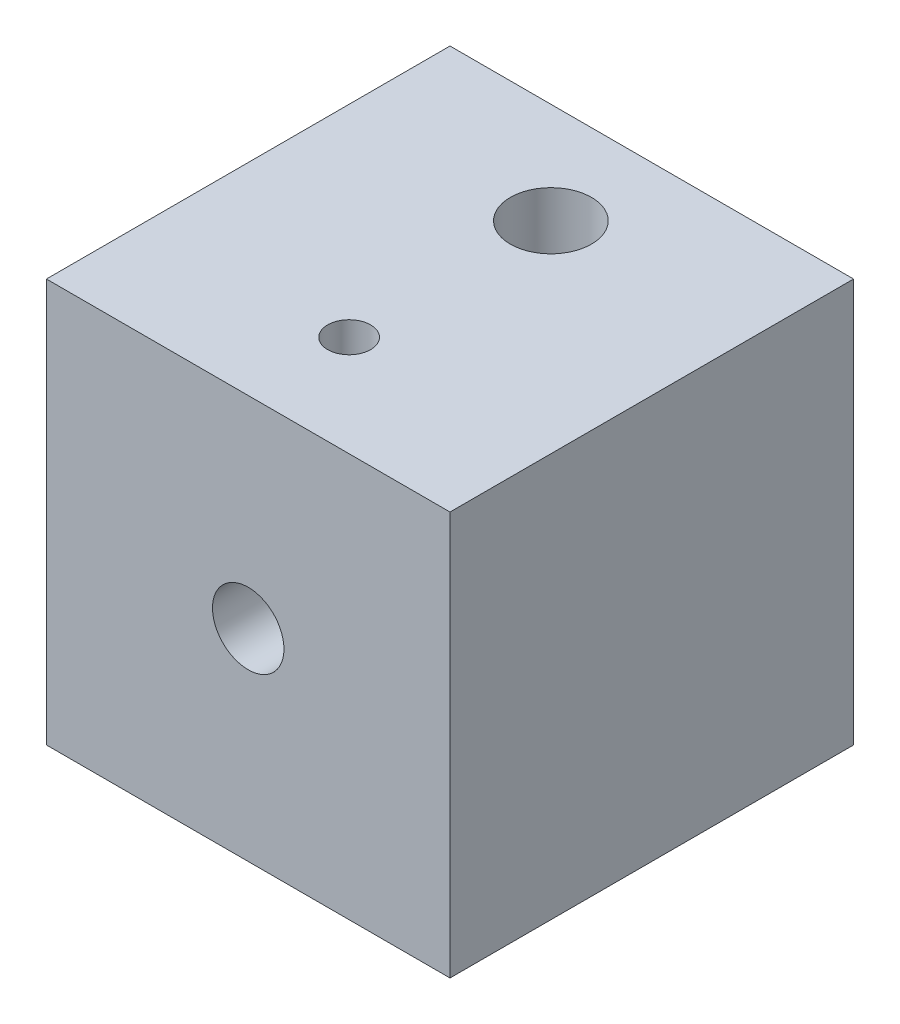
ISO-10303-21;
HEADER;
FILE_DESCRIPTION(('STEP AP214'),'2;1');
FILE_NAME('part.step','',(''),(''),'','','');
FILE_SCHEMA(('AUTOMOTIVE_DESIGN { 1 0 10303 214 1 1 1 1 }'));
ENDSEC;
DATA;
#1=APPLICATION_CONTEXT('core data for automotive mechanical design processes');
#2=APPLICATION_PROTOCOL_DEFINITION('international standard','automotive_design',2000,#1);
#3=PRODUCT_CONTEXT('',#1,'mechanical');
#4=PRODUCT('Part','Part','',(#3));
#5=PRODUCT_RELATED_PRODUCT_CATEGORY('part','',(#4));
#6=PRODUCT_DEFINITION_FORMATION('','',#4);
#7=PRODUCT_DEFINITION_CONTEXT('part definition',#1,'design');
#8=PRODUCT_DEFINITION('design','',#6,#7);
#9=PRODUCT_DEFINITION_SHAPE('','',#8);
#10=(LENGTH_UNIT() NAMED_UNIT(*) SI_UNIT(.MILLI.,.METRE.));
#11=(NAMED_UNIT(*) PLANE_ANGLE_UNIT() SI_UNIT($,.RADIAN.));
#12=(NAMED_UNIT(*) SI_UNIT($,.STERADIAN.) SOLID_ANGLE_UNIT());
#13=UNCERTAINTY_MEASURE_WITH_UNIT(LENGTH_MEASURE(1.E-05),#10,'distance_accuracy_value','');
#14=(GEOMETRIC_REPRESENTATION_CONTEXT(3) GLOBAL_UNCERTAINTY_ASSIGNED_CONTEXT((#13)) GLOBAL_UNIT_ASSIGNED_CONTEXT((#10,
#11,#12)) REPRESENTATION_CONTEXT('',''));
#15=CARTESIAN_POINT('',(0.,0.,0.));
#16=DIRECTION('',(0.,0.,1.));
#17=DIRECTION('',(1.,0.,0.));
#18=AXIS2_PLACEMENT_3D('',#15,#16,#17);
#19=CARTESIAN_POINT('',(-12.7,25.4,12.7));
#20=DIRECTION('',(1.,0.,0.));
#21=DIRECTION('',(0.,0.,-1.));
#22=AXIS2_PLACEMENT_3D('',#19,#20,#21);
#23=PLANE('',#22);
#24=DIRECTION('',(0.,0.,1.));
#25=VECTOR('',#24,1.);
#26=CARTESIAN_POINT('',(-12.7,0.,12.7));
#27=LINE('',#26,#25);
#28=CARTESIAN_POINT('',(-12.7,0.,-12.7));
#29=VERTEX_POINT('',#28);
#30=CARTESIAN_POINT('',(-12.7,0.,12.7));
#31=VERTEX_POINT('',#30);
#32=EDGE_CURVE('E100',#29,#31,#27,.T.);
#33=ORIENTED_EDGE('',*,*,#32,.T.);
#34=DIRECTION('',(0.,-1.,0.));
#35=VECTOR('',#34,1.);
#36=CARTESIAN_POINT('',(-12.7,25.4,12.7));
#37=LINE('',#36,#35);
#38=CARTESIAN_POINT('',(-12.7,25.4,12.7));
#39=VERTEX_POINT('',#38);
#40=EDGE_CURVE('E11',#39,#31,#37,.T.);
#41=ORIENTED_EDGE('',*,*,#40,.F.);
#42=DIRECTION('',(0.,0.,1.));
#43=VECTOR('',#42,1.);
#44=CARTESIAN_POINT('',(-12.7,25.4,12.7));
#45=LINE('',#44,#43);
#46=CARTESIAN_POINT('',(-12.7,25.4,-12.7));
#47=VERTEX_POINT('',#46);
#48=EDGE_CURVE('E88',#47,#39,#45,.T.);
#49=ORIENTED_EDGE('',*,*,#48,.F.);
#50=DIRECTION('',(0.,-1.,0.));
#51=VECTOR('',#50,1.);
#52=CARTESIAN_POINT('',(-12.7,25.4,-12.7));
#53=LINE('',#52,#51);
#54=EDGE_CURVE('E96',#47,#29,#53,.T.);
#55=ORIENTED_EDGE('',*,*,#54,.T.);
#56=EDGE_LOOP('',(#33,#41,#49,#55));
#57=FACE_BOUND('',#56,.T.);
#58=ADVANCED_FACE('F37',(#57),#23,.F.);
#59=CARTESIAN_POINT('',(12.7,25.4,12.7));
#60=DIRECTION('',(0.,0.,-1.));
#61=DIRECTION('',(-1.,0.,0.));
#62=AXIS2_PLACEMENT_3D('',#59,#60,#61);
#63=PLANE('',#62);
#64=CARTESIAN_POINT('',(0.,12.7,12.7));
#65=DIRECTION('',(0.,0.,1.));
#66=DIRECTION('',(1.,0.,0.));
#67=AXIS2_PLACEMENT_3D('',#64,#65,#66);
#68=CIRCLE('',#67,2.25);
#69=CARTESIAN_POINT('',(2.25,12.7,12.7));
#70=VERTEX_POINT('',#69);
#71=EDGE_CURVE('E103',#70,#70,#68,.T.);
#72=ORIENTED_EDGE('',*,*,#71,.F.);
#73=EDGE_LOOP('',(#72));
#74=FACE_BOUND('',#73,.T.);
#75=DIRECTION('',(1.,0.,0.));
#76=VECTOR('',#75,1.);
#77=CARTESIAN_POINT('',(12.7,0.,12.7));
#78=LINE('',#77,#76);
#79=CARTESIAN_POINT('',(12.7,0.,12.7));
#80=VERTEX_POINT('',#79);
#81=EDGE_CURVE('E92',#31,#80,#78,.T.);
#82=ORIENTED_EDGE('',*,*,#81,.T.);
#83=DIRECTION('',(0.,-1.,0.));
#84=VECTOR('',#83,1.);
#85=CARTESIAN_POINT('',(12.7,25.4,12.7));
#86=LINE('',#85,#84);
#87=CARTESIAN_POINT('',(12.7,25.4,12.7));
#88=VERTEX_POINT('',#87);
#89=EDGE_CURVE('E45',#88,#80,#86,.T.);
#90=ORIENTED_EDGE('',*,*,#89,.F.);
#91=DIRECTION('',(1.,0.,0.));
#92=VECTOR('',#91,1.);
#93=CARTESIAN_POINT('',(12.7,25.4,12.7));
#94=LINE('',#93,#92);
#95=EDGE_CURVE('E83',#39,#88,#94,.T.);
#96=ORIENTED_EDGE('',*,*,#95,.F.);
#97=ORIENTED_EDGE('',*,*,#40,.T.);
#98=EDGE_LOOP('',(#82,#90,#96,#97));
#99=FACE_BOUND('',#98,.T.);
#100=ADVANCED_FACE('F91',(#74,#99),#63,.F.);
#101=CARTESIAN_POINT('',(12.7,25.4,12.7));
#102=DIRECTION('',(-1.,0.,0.));
#103=DIRECTION('',(0.,0.,1.));
#104=AXIS2_PLACEMENT_3D('',#101,#102,#103);
#105=PLANE('',#104);
#106=DIRECTION('',(0.,0.,-1.));
#107=VECTOR('',#106,1.);
#108=CARTESIAN_POINT('',(12.7,0.,12.7));
#109=LINE('',#108,#107);
#110=CARTESIAN_POINT('',(12.7,0.,-12.7));
#111=VERTEX_POINT('',#110);
#112=EDGE_CURVE('E70',#80,#111,#109,.T.);
#113=ORIENTED_EDGE('',*,*,#112,.T.);
#114=DIRECTION('',(0.,-1.,0.));
#115=VECTOR('',#114,1.);
#116=CARTESIAN_POINT('',(12.7,25.4,-12.7));
#117=LINE('',#116,#115);
#118=CARTESIAN_POINT('',(12.7,25.4,-12.7));
#119=VERTEX_POINT('',#118);
#120=EDGE_CURVE('E93',#119,#111,#117,.T.);
#121=ORIENTED_EDGE('',*,*,#120,.F.);
#122=DIRECTION('',(0.,0.,-1.));
#123=VECTOR('',#122,1.);
#124=CARTESIAN_POINT('',(12.7,25.4,12.7));
#125=LINE('',#124,#123);
#126=EDGE_CURVE('E86',#88,#119,#125,.T.);
#127=ORIENTED_EDGE('',*,*,#126,.F.);
#128=ORIENTED_EDGE('',*,*,#89,.T.);
#129=EDGE_LOOP('',(#113,#121,#127,#128));
#130=FACE_BOUND('',#129,.T.);
#131=ADVANCED_FACE('F94',(#130),#105,.F.);
#132=CARTESIAN_POINT('',(12.7,25.4,-12.7));
#133=DIRECTION('',(0.,0.,1.));
#134=DIRECTION('',(1.,0.,0.));
#135=AXIS2_PLACEMENT_3D('',#132,#133,#134);
#136=PLANE('',#135);
#137=CARTESIAN_POINT('',(0.,12.7,-12.7));
#138=DIRECTION('',(0.,0.,-1.));
#139=DIRECTION('',(-1.,0.,0.));
#140=AXIS2_PLACEMENT_3D('',#137,#138,#139);
#141=CIRCLE('',#140,6.985);
#142=CARTESIAN_POINT('',(-6.985,12.7,-12.7));
#143=VERTEX_POINT('',#142);
#144=EDGE_CURVE('E120',#143,#143,#141,.T.);
#145=ORIENTED_EDGE('',*,*,#144,.F.);
#146=EDGE_LOOP('',(#145));
#147=FACE_BOUND('',#146,.T.);
#148=DIRECTION('',(-1.,0.,0.));
#149=VECTOR('',#148,1.);
#150=CARTESIAN_POINT('',(12.7,0.,-12.7));
#151=LINE('',#150,#149);
#152=EDGE_CURVE('E76',#111,#29,#151,.T.);
#153=ORIENTED_EDGE('',*,*,#152,.T.);
#154=ORIENTED_EDGE('',*,*,#54,.F.);
#155=DIRECTION('',(-1.,0.,0.));
#156=VECTOR('',#155,1.);
#157=CARTESIAN_POINT('',(12.7,25.4,-12.7));
#158=LINE('',#157,#156);
#159=EDGE_CURVE('E53',#119,#47,#158,.T.);
#160=ORIENTED_EDGE('',*,*,#159,.F.);
#161=ORIENTED_EDGE('',*,*,#120,.T.);
#162=EDGE_LOOP('',(#153,#154,#160,#161));
#163=FACE_BOUND('',#162,.T.);
#164=ADVANCED_FACE('F108',(#147,#163),#136,.F.);
#165=CARTESIAN_POINT('',(0.,25.4,0.));
#166=DIRECTION('',(0.,1.,0.));
#167=DIRECTION('',(0.,0.,1.));
#168=AXIS2_PLACEMENT_3D('',#165,#166,#167);
#169=PLANE('',#168);
#170=CARTESIAN_POINT('',(0.,25.4,-6.35));
#171=DIRECTION('',(0.,1.,0.));
#172=DIRECTION('',(0.,0.,1.));
#173=AXIS2_PLACEMENT_3D('',#170,#171,#172);
#174=CIRCLE('',#173,2.5527);
#175=CARTESIAN_POINT('',(0.,25.4,-3.7973));
#176=VERTEX_POINT('',#175);
#177=EDGE_CURVE('E153',#176,#176,#174,.T.);
#178=ORIENTED_EDGE('',*,*,#177,.F.);
#179=EDGE_LOOP('',(#178));
#180=FACE_BOUND('',#179,.T.);
#181=CARTESIAN_POINT('',(0.,25.4,6.35));
#182=DIRECTION('',(0.,1.,0.));
#183=DIRECTION('',(0.,0.,1.));
#184=AXIS2_PLACEMENT_3D('',#181,#182,#183);
#185=CIRCLE('',#184,1.35254999999999);
#186=CARTESIAN_POINT('',(0.,25.4,7.70254999999999));
#187=VERTEX_POINT('',#186);
#188=EDGE_CURVE('E133',#187,#187,#185,.T.);
#189=ORIENTED_EDGE('',*,*,#188,.F.);
#190=EDGE_LOOP('',(#189));
#191=FACE_BOUND('',#190,.T.);
#192=ORIENTED_EDGE('',*,*,#48,.T.);
#193=ORIENTED_EDGE('',*,*,#95,.T.);
#194=ORIENTED_EDGE('',*,*,#126,.T.);
#195=ORIENTED_EDGE('',*,*,#159,.T.);
#196=EDGE_LOOP('',(#192,#193,#194,#195));
#197=FACE_BOUND('',#196,.T.);
#198=ADVANCED_FACE('F84',(#180,#191,#197),#169,.T.);
#199=CARTESIAN_POINT('',(0.,0.,0.));
#200=DIRECTION('',(0.,1.,0.));
#201=DIRECTION('',(0.,0.,1.));
#202=AXIS2_PLACEMENT_3D('',#199,#200,#201);
#203=PLANE('',#202);
#204=ORIENTED_EDGE('',*,*,#32,.F.);
#205=ORIENTED_EDGE('',*,*,#152,.F.);
#206=ORIENTED_EDGE('',*,*,#112,.F.);
#207=ORIENTED_EDGE('',*,*,#81,.F.);
#208=EDGE_LOOP('',(#204,#205,#206,#207));
#209=FACE_BOUND('',#208,.T.);
#210=ADVANCED_FACE('F111',(#209),#203,.F.);
#211=CARTESIAN_POINT('',(0.,12.7,0.));
#212=DIRECTION('',(0.,0.,1.));
#213=DIRECTION('',(1.,0.,0.));
#214=AXIS2_PLACEMENT_3D('',#211,#212,#213);
#215=CYLINDRICAL_SURFACE('',#214,2.25);
#216=CARTESIAN_POINT('',(0.,14.95,7.70254999999999));
#217=CARTESIAN_POINT('',(0.0691663465562286,14.9499965582015,7.70254624051206));
#218=CARTESIAN_POINT('',(0.138441993777319,14.9467759995988,7.69720740303272));
#219=CARTESIAN_POINT('',(0.274907659000748,14.9341995828276,7.67612537949973));
#220=CARTESIAN_POINT('',(0.34209216343151,14.9248287429108,7.66035678640166));
#221=CARTESIAN_POINT('',(0.472109070479141,14.9009001743146,7.61930258533119));
#222=CARTESIAN_POINT('',(0.534961248817198,14.8863681771959,7.59406415571863));
#223=CARTESIAN_POINT('',(0.65534004842601,14.8533533368001,7.53508154373845));
#224=CARTESIAN_POINT('',(0.712867953286609,14.834871449347,7.50133941880544));
#225=CARTESIAN_POINT('',(0.825955531404719,14.7938448864383,7.42343341840502));
#226=CARTESIAN_POINT('',(0.881026569171476,14.7710974084211,7.3786690646969));
#227=CARTESIAN_POINT('',(0.983356150960087,14.7245194063919,7.28134193013879));
#228=CARTESIAN_POINT('',(1.03060449234187,14.7006875188712,7.22876913205521));
#229=CARTESIAN_POINT('',(1.12185227773009,14.6511430696786,7.10969732216007));
#230=CARTESIAN_POINT('',(1.16473451064853,14.6255604815232,7.04228057641531));
#231=CARTESIAN_POINT('',(1.23840199779142,14.5790334387161,6.89969406382967));
#232=CARTESIAN_POINT('',(1.26920692739231,14.5580814647428,6.82453716103412));
#233=CARTESIAN_POINT('',(1.31131315422063,14.528511069332,6.68717330640225));
#234=CARTESIAN_POINT('',(1.32553159551199,14.5181343277019,6.62624073075496));
#235=CARTESIAN_POINT('',(1.34540710548992,14.5034794617843,6.50230622263213));
#236=CARTESIAN_POINT('',(1.35107488112002,14.4991937108912,6.43930697921192));
#237=CARTESIAN_POINT('',(1.35352111427406,14.4973547046947,6.31290918535839));
#238=CARTESIAN_POINT('',(1.35028188948818,14.4998148414008,6.24951009028621));
#239=CARTESIAN_POINT('',(1.33508362508444,14.5111146851313,6.12433339564388));
#240=CARTESIAN_POINT('',(1.32311800542564,14.5199592061781,6.06255705613199));
#241=CARTESIAN_POINT('',(1.29132248024854,14.542649315132,5.94298811732664));
#242=CARTESIAN_POINT('',(1.2715995097706,14.5564266813539,5.88515339804227));
#243=CARTESIAN_POINT('',(1.22501560830925,14.5874901121005,5.77346340368081));
#244=CARTESIAN_POINT('',(1.19815206522393,14.6047774600683,5.71960959409813));
#245=CARTESIAN_POINT('',(1.13262049663752,14.6445778497762,5.60737357417374));
#246=CARTESIAN_POINT('',(1.09270844272989,14.6674756360272,5.54985380321864));
#247=CARTESIAN_POINT('',(1.00464204441058,14.7138709888924,5.44172969187937));
#248=CARTESIAN_POINT('',(0.956479789698275,14.7373691125402,5.3911320729916));
#249=CARTESIAN_POINT('',(0.845239746176339,14.786205654396,5.29108002821639));
#250=CARTESIAN_POINT('',(0.781017120452645,14.8113389839092,5.24278435724409));
#251=CARTESIAN_POINT('',(0.643848974151532,14.8571217017953,5.15779775231295));
#252=CARTESIAN_POINT('',(0.570908101435357,14.8777734629875,5.12110067262165));
#253=CARTESIAN_POINT('',(0.422942930715708,14.9111084787451,5.06297937950749));
#254=CARTESIAN_POINT('',(0.348336461238115,14.924210384158,5.04074140057072));
#255=CARTESIAN_POINT('',(0.195525060556504,14.942803686195,5.00939431995385));
#256=CARTESIAN_POINT('',(0.117324596807471,14.9483042805444,5.00026935075758));
#257=CARTESIAN_POINT('',(-0.0288647439610792,14.9508383501165,4.99605683434077));
#258=CARTESIAN_POINT('',(-0.0967920631799346,14.9489240898226,4.99922487001459));
#259=CARTESIAN_POINT('',(-0.230975024660799,14.9391232290591,5.01560572260461));
#260=CARTESIAN_POINT('',(-0.297230703822403,14.9312367605387,5.02881831759757));
#261=CARTESIAN_POINT('',(-0.42463255446565,14.9104876464588,5.06417536374375));
#262=CARTESIAN_POINT('',(-0.485864932166425,14.8977539716197,5.08608890854587));
#263=CARTESIAN_POINT('',(-0.603768813431152,14.8683310369898,5.13797403410806));
#264=CARTESIAN_POINT('',(-0.660439421608037,14.8516410031661,5.16794719182728));
#265=CARTESIAN_POINT('',(-0.77396616067724,14.8136274945279,5.23856411639785));
#266=CARTESIAN_POINT('',(-0.830232294175253,14.7920030297816,5.27999203325865));
#267=CARTESIAN_POINT('',(-0.935438719842702,14.7471280248976,5.37062467026623));
#268=CARTESIAN_POINT('',(-0.984370364009692,14.7238756119073,5.41983843229997));
#269=CARTESIAN_POINT('',(-1.08012013953285,14.6746143105901,5.53215470164736));
#270=CARTESIAN_POINT('',(-1.12582126496346,14.6486434524324,5.5962321051443));
#271=CARTESIAN_POINT('',(-1.20584939408476,14.6001631063901,5.73231684695754));
#272=CARTESIAN_POINT('',(-1.2401882202709,14.577650033829,5.80431583820908));
#273=CARTESIAN_POINT('',(-1.29000227834163,14.5436651523797,5.93860364729619));
#274=CARTESIAN_POINT('',(-1.30794928293521,14.5308590134357,5.99963412959578));
#275=CARTESIAN_POINT('',(-1.335142937583,14.5111271886318,6.12449300739672));
#276=CARTESIAN_POINT('',(-1.34440173008629,14.5041932971776,6.18831736718525));
#277=CARTESIAN_POINT('',(-1.35370346239094,14.4972270341239,6.31727475894175));
#278=CARTESIAN_POINT('',(-1.35371101276565,14.4972211647772,6.38241186308454));
#279=CARTESIAN_POINT('',(-1.34441879961754,14.5041807166454,6.51165392374441));
#280=CARTESIAN_POINT('',(-1.33511403404654,14.5111498844547,6.57575830673886));
#281=CARTESIAN_POINT('',(-1.30844899732832,14.5304947994172,6.69795754306172));
#282=CARTESIAN_POINT('',(-1.29151061258881,14.5425856138585,6.75619278350051));
#283=CARTESIAN_POINT('',(-1.25043918193695,14.5707001610648,6.8690408385129));
#284=CARTESIAN_POINT('',(-1.22630342229112,14.5867253768722,6.92365227723878));
#285=CARTESIAN_POINT('',(-1.16727448902225,14.6238924767988,7.03667845423186));
#286=CARTESIAN_POINT('',(-1.1312993664033,14.6454421423168,7.0943926309853));
#287=CARTESIAN_POINT('',(-1.05140239370995,14.6897596355561,7.20353698104831));
#288=CARTESIAN_POINT('',(-1.00747398959468,14.712528456964,7.25496191259399));
#289=CARTESIAN_POINT('',(-0.904409529607908,14.7611400899125,7.3587754673059));
#290=CARTESIAN_POINT('',(-0.843960269762932,14.7868708946229,7.40992545750814));
#291=CARTESIAN_POINT('',(-0.714053471510947,14.8348104286257,7.50144497424646));
#292=CARTESIAN_POINT('',(-0.644592627427999,14.8570178587776,7.54181052807425));
#293=CARTESIAN_POINT('',(-0.500359294821429,14.8948886199301,7.60903763380208));
#294=CARTESIAN_POINT('',(-0.425802196527544,14.9107246994756,7.63626035101019));
#295=CARTESIAN_POINT('',(-0.272063440642145,14.9348330717528,7.67727171648868));
#296=CARTESIAN_POINT('',(-0.192900374921494,14.9431337949377,7.69111087316339));
#297=CARTESIAN_POINT('',(-0.094296605554487,14.9481032860704,7.69939222834888));
#298=CARTESIAN_POINT('',(-0.0754665563458836,14.948813228343,7.70057494326877));
#299=CARTESIAN_POINT('',(-0.0377603884228852,14.9497620637854,7.70215435670861));
#300=CARTESIAN_POINT('',(-0.018884268046562,14.9500009397033,7.70255102644105));
#301=CARTESIAN_POINT('',(0.,14.95,7.70254999999999));
#302=B_SPLINE_CURVE_WITH_KNOTS('',3,(#216,#217,#218,#219,#220,#221,#222,#223,#224,#225,#226,
#227,#228,#229,#230,#231,#232,#233,#234,#235,#236,#237,#238,#239,#240,#241,#242,#243,#244,#245,
#246,#247,#248,#249,#250,#251,#252,#253,#254,#255,#256,#257,#258,#259,#260,#261,#262,#263,#264,
#265,#266,#267,#268,#269,#270,#271,#272,#273,#274,#275,#276,#277,#278,#279,#280,#281,#282,#283,
#284,#285,#286,#287,#288,#289,#290,#291,#292,#293,#294,#295,#296,#297,#298,#299,#300,#301),
.UNSPECIFIED.,.T.,.F.,(4,2,2,2,2,2,2,2,2,2,2,2,2,2,2,2,2,2,2,2,2,2,2,2,2,2,2,2,2,2,2,2,2,2,2,2,
2,2,2,2,2,2,4),(0.,0.207418103053482,0.415343349921218,0.622246186168253,0.829099011090456,
1.05180291082188,1.27479501908119,1.52525676392386,1.7753087639637,1.96477592479399,
2.154005641787,2.34361129149922,2.53336005925798,2.72057998717775,2.90786849673549,
3.12800610445697,3.34835597397155,3.59965533982461,3.85082132586437,4.08622923144469,
4.32135203899775,4.52441463297843,4.72747274064964,4.9254681124717,5.1235022526688,
5.34206941637168,5.56089229619367,5.80838712408367,6.05562361732438,6.24949694268854,
6.44309890974798,6.63744147371423,6.83188848354468,7.01670300441852,7.20158729696069,
7.41481706479237,7.62822335482225,7.87680964698578,8.12548738606174,8.36687548539565,
8.60734901010115,8.66397764248819,8.72060834876075),.UNSPECIFIED.);
#303=CARTESIAN_POINT('',(0.,14.95,7.70254999999999));
#304=VERTEX_POINT('',#303);
#305=EDGE_CURVE('E123',#304,#304,#302,.T.);
#306=ORIENTED_EDGE('',*,*,#305,.T.);
#307=EDGE_LOOP('',(#306));
#308=FACE_BOUND('',#307,.T.);
#309=CARTESIAN_POINT('',(0.,12.7,0.));
#310=DIRECTION('',(0.,0.,1.));
#311=DIRECTION('',(1.,0.,0.));
#312=AXIS2_PLACEMENT_3D('',#309,#310,#311);
#313=CIRCLE('',#312,2.25);
#314=CARTESIAN_POINT('',(2.25,12.7,0.));
#315=VERTEX_POINT('',#314);
#316=EDGE_CURVE('E116',#315,#315,#313,.T.);
#317=ORIENTED_EDGE('',*,*,#316,.F.);
#318=EDGE_LOOP('',(#317));
#319=FACE_BOUND('',#318,.T.);
#320=ORIENTED_EDGE('',*,*,#71,.T.);
#321=EDGE_LOOP('',(#320));
#322=FACE_BOUND('',#321,.T.);
#323=ADVANCED_FACE('F168',(#308,#319,#322),#215,.F.);
#324=CARTESIAN_POINT('',(0.,12.7,0.));
#325=DIRECTION('',(0.,0.,-1.));
#326=DIRECTION('',(-1.,0.,0.));
#327=AXIS2_PLACEMENT_3D('',#324,#325,#326);
#328=PLANE('',#327);
#329=CARTESIAN_POINT('',(0.,12.7,0.));
#330=DIRECTION('',(0.,0.,-1.));
#331=DIRECTION('',(-1.,0.,0.));
#332=AXIS2_PLACEMENT_3D('',#329,#330,#331);
#333=CIRCLE('',#332,6.985);
#334=CARTESIAN_POINT('',(-6.985,12.7,0.));
#335=VERTEX_POINT('',#334);
#336=EDGE_CURVE('E119',#335,#335,#333,.T.);
#337=ORIENTED_EDGE('',*,*,#336,.T.);
#338=EDGE_LOOP('',(#337));
#339=FACE_BOUND('',#338,.T.);
#340=ORIENTED_EDGE('',*,*,#316,.T.);
#341=EDGE_LOOP('',(#340));
#342=FACE_BOUND('',#341,.T.);
#343=ADVANCED_FACE('F185',(#339,#342),#328,.T.);
#344=CARTESIAN_POINT('',(0.,12.7,0.));
#345=DIRECTION('',(0.,0.,-1.));
#346=DIRECTION('',(-1.,0.,0.));
#347=AXIS2_PLACEMENT_3D('',#344,#345,#346);
#348=CYLINDRICAL_SURFACE('',#347,6.985);
#349=CARTESIAN_POINT('',(0.,19.685,-3.7973));
#350=CARTESIAN_POINT('',(0.138492655769171,19.6850027875156,-3.79729620371324));
#351=CARTESIAN_POINT('',(0.276958692994929,19.6808447576561,-3.80860616501723));
#352=CARTESIAN_POINT('',(0.549766352127538,19.6646715720193,-3.85337489292544));
#353=CARTESIAN_POINT('',(0.684108334407801,19.652657104821,-3.88683171846639));
#354=CARTESIAN_POINT('',(0.944694933728958,19.6220645100469,-3.97456217037204));
#355=CARTESIAN_POINT('',(1.07095417236525,19.6034986544219,-4.02879689209613));
#356=CARTESIAN_POINT('',(1.31257665957332,19.56166319663,-4.15635095760453));
#357=CARTESIAN_POINT('',(1.42793713814355,19.5383924033617,-4.22967513542817));
#358=CARTESIAN_POINT('',(1.64917596033623,19.4885035152444,-4.39644354230431));
#359=CARTESIAN_POINT('',(1.75455204469218,19.461794019396,-4.49052650315817));
#360=CARTESIAN_POINT('',(1.94843029521024,19.408500030934,-4.69478560817419));
#361=CARTESIAN_POINT('',(2.03692766654876,19.3819155759269,-4.80496630965348));
#362=CARTESIAN_POINT('',(2.19765067596587,19.3308323110136,-5.04310798072097));
#363=CARTESIAN_POINT('',(2.26918043283897,19.306442226796,-5.17156424189145));
#364=CARTESIAN_POINT('',(2.38939884875655,19.2639237164864,-5.43971647291078));
#365=CARTESIAN_POINT('',(2.43809610989306,19.2457929328967,-5.57940818655271));
#366=CARTESIAN_POINT('',(2.5093075768102,19.2188194939355,-5.86029819119308));
#367=CARTESIAN_POINT('',(2.53277655008223,19.2096394711897,-6.00122097028899));
#368=CARTESIAN_POINT('',(2.55585077995395,19.2006169399691,-6.28528045748168));
#369=CARTESIAN_POINT('',(2.55546526667413,19.2007708198861,-6.42841628784017));
#370=CARTESIAN_POINT('',(2.53157416565125,19.2101066741882,-6.70425162017124));
#371=CARTESIAN_POINT('',(2.5093733493125,19.2187791413426,-6.83708452693697));
#372=CARTESIAN_POINT('',(2.44463204023832,19.2433313559788,-7.09698992876352));
#373=CARTESIAN_POINT('',(2.40208863982893,19.2592121337665,-7.22406159749628));
#374=CARTESIAN_POINT('',(2.29712149372937,19.2967114164634,-7.4715684985507));
#375=CARTESIAN_POINT('',(2.234348102154,19.318429626802,-7.59183967796879));
#376=CARTESIAN_POINT('',(2.09094624219551,19.3651214356041,-7.82052792307115));
#377=CARTESIAN_POINT('',(2.01031183310299,19.3900961160545,-7.92894102670598));
#378=CARTESIAN_POINT('',(1.82743687241918,19.442424753672,-8.13808534323343));
#379=CARTESIAN_POINT('',(1.72414863220897,19.4698290322496,-8.23789002686473));
#380=CARTESIAN_POINT('',(1.5019791859364,19.5225585172922,-8.4190290349056));
#381=CARTESIAN_POINT('',(1.38309582190666,19.5478834352366,-8.50036079887217));
#382=CARTESIAN_POINT('',(1.13084325592737,19.59406012572,-8.64319894853571));
#383=CARTESIAN_POINT('',(0.997294260266532,19.6148441743357,-8.7044112570104));
#384=CARTESIAN_POINT('',(0.72084700932782,19.6490979280015,-8.80319727074313));
#385=CARTESIAN_POINT('',(0.577952717203421,19.6625707113631,-8.84078092559131));
#386=CARTESIAN_POINT('',(0.294680011674702,19.6801501924253,-8.88949511899632));
#387=CARTESIAN_POINT('',(0.154543512523927,19.6846985592841,-8.90187429853407));
#388=CARTESIAN_POINT('',(-0.12586116082304,19.6852719964643,-8.90344513188915));
#389=CARTESIAN_POINT('',(-0.266129301448061,19.6812988448102,-8.89264162280038));
#390=CARTESIAN_POINT('',(-0.537515242350925,19.665567416174,-8.84911295189936));
#391=CARTESIAN_POINT('',(-0.668780564154037,19.6540954171626,-8.81719340156662));
#392=CARTESIAN_POINT('',(-0.92401026036513,19.6248064628447,-8.7333866205905));
#393=CARTESIAN_POINT('',(-1.04797368252404,19.6069886821031,-8.68149679221867));
#394=CARTESIAN_POINT('',(-1.28907411312255,19.5661416925236,-8.55759251984651));
#395=CARTESIAN_POINT('',(-1.40591191144668,19.5429772365213,-8.48504178511766));
#396=CARTESIAN_POINT('',(-1.62613701719044,19.4940158084932,-8.32248648182922));
#397=CARTESIAN_POINT('',(-1.72951952083379,19.4682179021127,-8.23247570813584));
#398=CARTESIAN_POINT('',(-1.92584439323503,19.4150771445456,-8.03171842153177));
#399=CARTESIAN_POINT('',(-2.01789896535184,19.3877274108959,-7.92010330001006));
#400=CARTESIAN_POINT('',(-2.18213125349701,19.3359599977821,-7.68245683210078));
#401=CARTESIAN_POINT('',(-2.25430764419907,19.3115425138795,-7.55642452527719));
#402=CARTESIAN_POINT('',(-2.37669109197052,19.2685466681545,-7.29275204563203));
#403=CARTESIAN_POINT('',(-2.42684467508699,19.2499825494363,-7.15508457631018));
#404=CARTESIAN_POINT('',(-2.50295260882347,19.2212835981648,-6.87239722405721));
#405=CARTESIAN_POINT('',(-2.5289209148927,19.2111439048934,-6.72738163216149));
#406=CARTESIAN_POINT('',(-2.55470875102406,19.2010661703551,-6.44367930490968));
#407=CARTESIAN_POINT('',(-2.55603235006642,19.20054136512,-6.30514890149402));
#408=CARTESIAN_POINT('',(-2.53631069682303,19.2082611275457,-6.02995186100173));
#409=CARTESIAN_POINT('',(-2.51526735293301,19.2165049470485,-5.89328506592561));
#410=CARTESIAN_POINT('',(-2.4525569485521,19.2403562354473,-5.62949601893859));
#411=CARTESIAN_POINT('',(-2.411473247323,19.2557548644316,-5.50221461909809));
#412=CARTESIAN_POINT('',(-2.31035129886214,19.2920690223033,-5.25626996238653));
#413=CARTESIAN_POINT('',(-2.25030837964079,19.3129859108082,-5.13760883862583));
#414=CARTESIAN_POINT('',(-2.10945115314588,19.3592937908839,-4.90576725017194));
#415=CARTESIAN_POINT('',(-2.02774150904813,19.3848573020602,-4.79316558807103));
#416=CARTESIAN_POINT('',(-1.84728588627689,19.4369556410444,-4.58278990978906));
#417=CARTESIAN_POINT('',(-1.74853463394753,19.4634907675177,-4.48502050121367));
#418=CARTESIAN_POINT('',(-1.53085037801164,19.5161469945308,-4.30207895227323));
#419=CARTESIAN_POINT('',(-1.4111516754693,19.5421800109319,-4.21778871006572));
#420=CARTESIAN_POINT('',(-1.15838242984168,19.5894766437515,-4.07056719256177));
#421=CARTESIAN_POINT('',(-1.02531197141629,19.6107402903633,-4.00763578204834));
#422=CARTESIAN_POINT('',(-0.746379191127409,19.6464606716567,-3.90422997598057));
#423=CARTESIAN_POINT('',(-0.600298925894231,19.660756323289,-3.86428347986966));
#424=CARTESIAN_POINT('',(-0.302800257243105,19.6800224177578,-3.81082636752648));
#425=CARTESIAN_POINT('',(-0.151384226244188,19.6849969530089,-3.79730414966362));
#426=CARTESIAN_POINT('',(0.,19.685,-3.7973));
#427=B_SPLINE_CURVE_WITH_KNOTS('',3,(#349,#350,#351,#352,#353,#354,#355,#356,#357,#358,#359,
#360,#361,#362,#363,#364,#365,#366,#367,#368,#369,#370,#371,#372,#373,#374,#375,#376,#377,#378,
#379,#380,#381,#382,#383,#384,#385,#386,#387,#388,#389,#390,#391,#392,#393,#394,#395,#396,#397,
#398,#399,#400,#401,#402,#403,#404,#405,#406,#407,#408,#409,#410,#411,#412,#413,#414,#415,#416,
#417,#418,#419,#420,#421,#422,#423,#424,#425,#426),.UNSPECIFIED.,.T.,.F.,(4,2,2,2,2,2,2,2,2,2,2,
2,2,2,2,2,2,2,2,2,2,2,2,2,2,2,2,2,2,2,2,2,2,2,2,2,2,2,4),(0.,0.41491987840268,0.829803395941533,
1.24391385037709,1.65812927253169,2.08752070709061,2.51703394001145,2.96192244307333,
3.40664320043214,3.83386681848621,4.26092513007694,4.66390522714527,5.0669429415328,
5.47735807014848,5.88790991146229,6.3245620329017,6.76127463971923,7.20411269957259,
7.64676416337503,8.06689348103688,8.48693514677054,8.89181033731129,9.29673821171943,
9.7133218959054,10.1300539021654,10.569722541932,11.0094204883746,11.450180247499,
11.8906855204626,12.3042121820082,12.7177035634005,13.1198183690763,13.5220323425687,
13.9445446184627,14.367187879243,14.8111068641402,15.2550230386538,15.7087649399105,
16.1623075801066),.UNSPECIFIED.);
#428=CARTESIAN_POINT('',(0.,19.685,-3.7973));
#429=VERTEX_POINT('',#428);
#430=EDGE_CURVE('E147',#429,#429,#427,.T.);
#431=ORIENTED_EDGE('',*,*,#430,.T.);
#432=EDGE_LOOP('',(#431));
#433=FACE_BOUND('',#432,.T.);
#434=ORIENTED_EDGE('',*,*,#336,.F.);
#435=EDGE_LOOP('',(#434));
#436=FACE_BOUND('',#435,.T.);
#437=ORIENTED_EDGE('',*,*,#144,.T.);
#438=EDGE_LOOP('',(#437));
#439=FACE_BOUND('',#438,.T.);
#440=ADVANCED_FACE('F142',(#433,#436,#439),#348,.F.);
#441=CARTESIAN_POINT('',(0.,25.4,6.35));
#442=DIRECTION('',(0.,1.,0.));
#443=DIRECTION('',(0.,0.,1.));
#444=AXIS2_PLACEMENT_3D('',#441,#442,#443);
#445=CYLINDRICAL_SURFACE('',#444,1.35254999999999);
#446=ORIENTED_EDGE('',*,*,#305,.F.);
#447=EDGE_LOOP('',(#446));
#448=FACE_BOUND('',#447,.T.);
#449=ORIENTED_EDGE('',*,*,#188,.T.);
#450=EDGE_LOOP('',(#449));
#451=FACE_BOUND('',#450,.T.);
#452=ADVANCED_FACE('F137',(#448,#451),#445,.F.);
#453=CARTESIAN_POINT('',(0.,25.4,-6.35));
#454=DIRECTION('',(0.,1.,0.));
#455=DIRECTION('',(0.,0.,1.));
#456=AXIS2_PLACEMENT_3D('',#453,#454,#455);
#457=CYLINDRICAL_SURFACE('',#456,2.5527);
#458=ORIENTED_EDGE('',*,*,#430,.F.);
#459=EDGE_LOOP('',(#458));
#460=FACE_BOUND('',#459,.T.);
#461=ORIENTED_EDGE('',*,*,#177,.T.);
#462=EDGE_LOOP('',(#461));
#463=FACE_BOUND('',#462,.T.);
#464=ADVANCED_FACE('F141',(#460,#463),#457,.F.);
#465=CLOSED_SHELL('',(#58,#100,#131,#164,#198,#210,#323,#343,#440,#452,#464));
#466=MANIFOLD_SOLID_BREP('B2',#465);
#467=ADVANCED_BREP_SHAPE_REPRESENTATION('',(#18,#466),#14);
#468=SHAPE_DEFINITION_REPRESENTATION(#9,#467);
ENDSEC;
END-ISO-10303-21;
